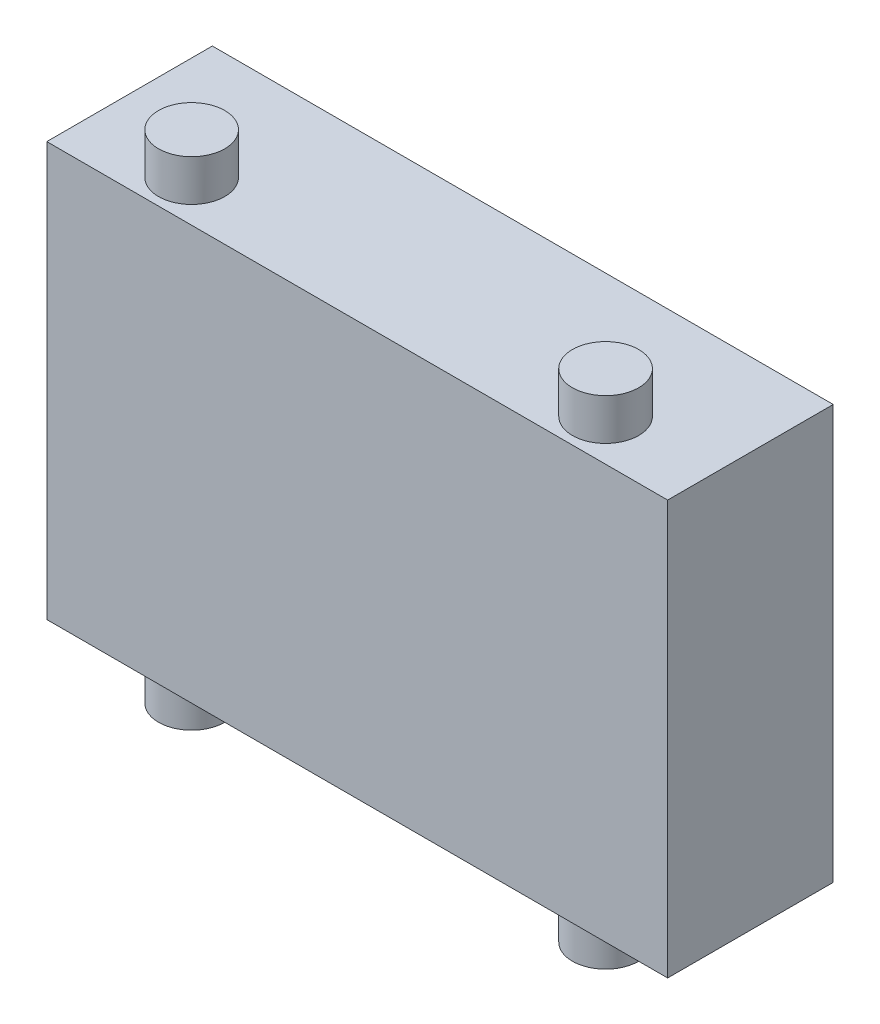
ISO-10303-21;
HEADER;
FILE_DESCRIPTION(('STEP AP214'),'2;1');
FILE_NAME('part.step','',(''),(''),'','','');
FILE_SCHEMA(('AUTOMOTIVE_DESIGN { 1 0 10303 214 1 1 1 1 }'));
ENDSEC;
DATA;
#1=APPLICATION_CONTEXT('core data for automotive mechanical design processes');
#2=APPLICATION_PROTOCOL_DEFINITION('international standard','automotive_design',2000,#1);
#3=PRODUCT_CONTEXT('',#1,'mechanical');
#4=PRODUCT('Part','Part','',(#3));
#5=PRODUCT_RELATED_PRODUCT_CATEGORY('part','',(#4));
#6=PRODUCT_DEFINITION_FORMATION('','',#4);
#7=PRODUCT_DEFINITION_CONTEXT('part definition',#1,'design');
#8=PRODUCT_DEFINITION('design','',#6,#7);
#9=PRODUCT_DEFINITION_SHAPE('','',#8);
#10=(LENGTH_UNIT() NAMED_UNIT(*) SI_UNIT(.MILLI.,.METRE.));
#11=(NAMED_UNIT(*) PLANE_ANGLE_UNIT() SI_UNIT($,.RADIAN.));
#12=(NAMED_UNIT(*) SI_UNIT($,.STERADIAN.) SOLID_ANGLE_UNIT());
#13=UNCERTAINTY_MEASURE_WITH_UNIT(LENGTH_MEASURE(1.E-05),#10,'distance_accuracy_value','');
#14=(GEOMETRIC_REPRESENTATION_CONTEXT(3) GLOBAL_UNCERTAINTY_ASSIGNED_CONTEXT((#13)) GLOBAL_UNIT_ASSIGNED_CONTEXT((#10,
#11,#12)) REPRESENTATION_CONTEXT('',''));
#15=CARTESIAN_POINT('',(0.,0.,0.));
#16=DIRECTION('',(0.,0.,1.));
#17=DIRECTION('',(1.,0.,0.));
#18=AXIS2_PLACEMENT_3D('',#15,#16,#17);
#19=CARTESIAN_POINT('',(150.,-100.,80.));
#20=DIRECTION('',(-1.,0.,0.));
#21=DIRECTION('',(0.,0.,1.));
#22=AXIS2_PLACEMENT_3D('',#19,#20,#21);
#23=PLANE('',#22);
#24=DIRECTION('',(0.,1.,0.));
#25=VECTOR('',#24,1.);
#26=CARTESIAN_POINT('',(150.,-100.,0.));
#27=LINE('',#26,#25);
#28=CARTESIAN_POINT('',(150.,-100.,0.));
#29=VERTEX_POINT('',#28);
#30=CARTESIAN_POINT('',(150.,100.,0.));
#31=VERTEX_POINT('',#30);
#32=EDGE_CURVE('E111',#29,#31,#27,.T.);
#33=ORIENTED_EDGE('',*,*,#32,.T.);
#34=DIRECTION('',(0.,0.,-1.));
#35=VECTOR('',#34,1.);
#36=CARTESIAN_POINT('',(150.,100.,80.));
#37=LINE('',#36,#35);
#38=CARTESIAN_POINT('',(150.,100.,80.));
#39=VERTEX_POINT('',#38);
#40=EDGE_CURVE('E100',#39,#31,#37,.T.);
#41=ORIENTED_EDGE('',*,*,#40,.F.);
#42=DIRECTION('',(0.,1.,0.));
#43=VECTOR('',#42,1.);
#44=CARTESIAN_POINT('',(150.,-100.,80.));
#45=LINE('',#44,#43);
#46=CARTESIAN_POINT('',(150.,-100.,80.));
#47=VERTEX_POINT('',#46);
#48=EDGE_CURVE('E92',#47,#39,#45,.T.);
#49=ORIENTED_EDGE('',*,*,#48,.F.);
#50=DIRECTION('',(0.,0.,-1.));
#51=VECTOR('',#50,1.);
#52=CARTESIAN_POINT('',(150.,-100.,80.));
#53=LINE('',#52,#51);
#54=EDGE_CURVE('E107',#47,#29,#53,.T.);
#55=ORIENTED_EDGE('',*,*,#54,.T.);
#56=EDGE_LOOP('',(#33,#41,#49,#55));
#57=FACE_BOUND('',#56,.T.);
#58=ADVANCED_FACE('F39',(#57),#23,.F.);
#59=CARTESIAN_POINT('',(-150.,100.,80.));
#60=DIRECTION('',(0.,-1.,0.));
#61=DIRECTION('',(0.,0.,-1.));
#62=AXIS2_PLACEMENT_3D('',#59,#60,#61);
#63=PLANE('',#62);
#64=CARTESIAN_POINT('',(99.9999999999999,100.,60.));
#65=DIRECTION('',(0.,-1.,0.));
#66=DIRECTION('',(0.,0.,-1.));
#67=AXIS2_PLACEMENT_3D('',#64,#65,#66);
#68=CIRCLE('',#67,16.0114967020006);
#69=CARTESIAN_POINT('',(99.9999999999999,100.,43.9885032979995));
#70=VERTEX_POINT('',#69);
#71=EDGE_CURVE('E11',#70,#70,#68,.F.);
#72=ORIENTED_EDGE('',*,*,#71,.F.);
#73=EDGE_LOOP('',(#72));
#74=FACE_BOUND('',#73,.T.);
#75=CARTESIAN_POINT('',(-100.,100.,60.));
#76=DIRECTION('',(0.,-1.,0.));
#77=DIRECTION('',(0.,0.,-1.));
#78=AXIS2_PLACEMENT_3D('',#75,#76,#77);
#79=CIRCLE('',#78,16.0114967020006);
#80=CARTESIAN_POINT('',(-100.,100.,43.9885032979995));
#81=VERTEX_POINT('',#80);
#82=EDGE_CURVE('E48',#81,#81,#79,.F.);
#83=ORIENTED_EDGE('',*,*,#82,.F.);
#84=EDGE_LOOP('',(#83));
#85=FACE_BOUND('',#84,.T.);
#86=DIRECTION('',(-1.,0.,0.));
#87=VECTOR('',#86,1.);
#88=CARTESIAN_POINT('',(-150.,100.,0.));
#89=LINE('',#88,#87);
#90=CARTESIAN_POINT('',(-150.,100.,0.));
#91=VERTEX_POINT('',#90);
#92=EDGE_CURVE('E98',#31,#91,#89,.T.);
#93=ORIENTED_EDGE('',*,*,#92,.T.);
#94=DIRECTION('',(0.,0.,-1.));
#95=VECTOR('',#94,1.);
#96=CARTESIAN_POINT('',(-150.,100.,80.));
#97=LINE('',#96,#95);
#98=CARTESIAN_POINT('',(-150.,100.,80.));
#99=VERTEX_POINT('',#98);
#100=EDGE_CURVE('E96',#99,#91,#97,.T.);
#101=ORIENTED_EDGE('',*,*,#100,.F.);
#102=DIRECTION('',(-1.,0.,0.));
#103=VECTOR('',#102,1.);
#104=CARTESIAN_POINT('',(-150.,100.,80.));
#105=LINE('',#104,#103);
#106=EDGE_CURVE('E87',#39,#99,#105,.T.);
#107=ORIENTED_EDGE('',*,*,#106,.F.);
#108=ORIENTED_EDGE('',*,*,#40,.T.);
#109=EDGE_LOOP('',(#93,#101,#107,#108));
#110=FACE_BOUND('',#109,.T.);
#111=ADVANCED_FACE('F97',(#74,#85,#110),#63,.F.);
#112=CARTESIAN_POINT('',(-150.,-100.,80.));
#113=DIRECTION('',(1.,0.,0.));
#114=DIRECTION('',(0.,0.,-1.));
#115=AXIS2_PLACEMENT_3D('',#112,#113,#114);
#116=PLANE('',#115);
#117=DIRECTION('',(0.,-1.,0.));
#118=VECTOR('',#117,1.);
#119=CARTESIAN_POINT('',(-150.,-100.,0.));
#120=LINE('',#119,#118);
#121=CARTESIAN_POINT('',(-150.,-100.,0.));
#122=VERTEX_POINT('',#121);
#123=EDGE_CURVE('E73',#91,#122,#120,.T.);
#124=ORIENTED_EDGE('',*,*,#123,.T.);
#125=DIRECTION('',(0.,0.,-1.));
#126=VECTOR('',#125,1.);
#127=CARTESIAN_POINT('',(-150.,-100.,80.));
#128=LINE('',#127,#126);
#129=CARTESIAN_POINT('',(-150.,-100.,80.));
#130=VERTEX_POINT('',#129);
#131=EDGE_CURVE('E101',#130,#122,#128,.T.);
#132=ORIENTED_EDGE('',*,*,#131,.F.);
#133=DIRECTION('',(0.,-1.,0.));
#134=VECTOR('',#133,1.);
#135=CARTESIAN_POINT('',(-150.,-100.,80.));
#136=LINE('',#135,#134);
#137=EDGE_CURVE('E90',#99,#130,#136,.T.);
#138=ORIENTED_EDGE('',*,*,#137,.F.);
#139=ORIENTED_EDGE('',*,*,#100,.T.);
#140=EDGE_LOOP('',(#124,#132,#138,#139));
#141=FACE_BOUND('',#140,.T.);
#142=ADVANCED_FACE('F103',(#141),#116,.F.);
#143=CARTESIAN_POINT('',(-150.,-100.,80.));
#144=DIRECTION('',(0.,1.,0.));
#145=DIRECTION('',(0.,0.,1.));
#146=AXIS2_PLACEMENT_3D('',#143,#144,#145);
#147=PLANE('',#146);
#148=CARTESIAN_POINT('',(99.9999999999999,-100.,60.));
#149=DIRECTION('',(0.,1.,0.));
#150=DIRECTION('',(0.,0.,-1.));
#151=AXIS2_PLACEMENT_3D('',#148,#149,#150);
#152=CIRCLE('',#151,16.0114967020006);
#153=CARTESIAN_POINT('',(99.9999999999999,-100.,43.9885032979995));
#154=VERTEX_POINT('',#153);
#155=EDGE_CURVE('E197',#154,#154,#152,.T.);
#156=ORIENTED_EDGE('',*,*,#155,.T.);
#157=EDGE_LOOP('',(#156));
#158=FACE_BOUND('',#157,.T.);
#159=CARTESIAN_POINT('',(-100.,-100.,60.));
#160=DIRECTION('',(0.,1.,0.));
#161=DIRECTION('',(0.,0.,1.));
#162=AXIS2_PLACEMENT_3D('',#159,#160,#161);
#163=CIRCLE('',#162,16.0114967020006);
#164=CARTESIAN_POINT('',(-100.,-100.,76.0114967020006));
#165=VERTEX_POINT('',#164);
#166=EDGE_CURVE('E210',#165,#165,#163,.T.);
#167=ORIENTED_EDGE('',*,*,#166,.T.);
#168=EDGE_LOOP('',(#167));
#169=FACE_BOUND('',#168,.T.);
#170=DIRECTION('',(1.,0.,0.));
#171=VECTOR('',#170,1.);
#172=CARTESIAN_POINT('',(-150.,-100.,0.));
#173=LINE('',#172,#171);
#174=EDGE_CURVE('E79',#122,#29,#173,.T.);
#175=ORIENTED_EDGE('',*,*,#174,.T.);
#176=ORIENTED_EDGE('',*,*,#54,.F.);
#177=DIRECTION('',(1.,0.,0.));
#178=VECTOR('',#177,1.);
#179=CARTESIAN_POINT('',(-150.,-100.,80.));
#180=LINE('',#179,#178);
#181=EDGE_CURVE('E56',#130,#47,#180,.T.);
#182=ORIENTED_EDGE('',*,*,#181,.F.);
#183=ORIENTED_EDGE('',*,*,#131,.T.);
#184=EDGE_LOOP('',(#175,#176,#182,#183));
#185=FACE_BOUND('',#184,.T.);
#186=ADVANCED_FACE('F139',(#158,#169,#185),#147,.F.);
#187=CARTESIAN_POINT('',(0.,0.,80.));
#188=DIRECTION('',(0.,0.,-1.));
#189=DIRECTION('',(-1.,0.,0.));
#190=AXIS2_PLACEMENT_3D('',#187,#188,#189);
#191=PLANE('',#190);
#192=ORIENTED_EDGE('',*,*,#48,.T.);
#193=ORIENTED_EDGE('',*,*,#106,.T.);
#194=ORIENTED_EDGE('',*,*,#137,.T.);
#195=ORIENTED_EDGE('',*,*,#181,.T.);
#196=EDGE_LOOP('',(#192,#193,#194,#195));
#197=FACE_BOUND('',#196,.T.);
#198=ADVANCED_FACE('F88',(#197),#191,.F.);
#199=CARTESIAN_POINT('',(0.,0.,0.));
#200=DIRECTION('',(0.,0.,-1.));
#201=DIRECTION('',(-1.,0.,0.));
#202=AXIS2_PLACEMENT_3D('',#199,#200,#201);
#203=PLANE('',#202);
#204=CARTESIAN_POINT('',(-84.110111850432,0.,0.));
#205=DIRECTION('',(0.,0.,-1.));
#206=DIRECTION('',(-1.,0.,0.));
#207=AXIS2_PLACEMENT_3D('',#204,#205,#206);
#208=CIRCLE('',#207,19.343729762712);
#209=CARTESIAN_POINT('',(-103.453841613144,0.,0.));
#210=VERTEX_POINT('',#209);
#211=EDGE_CURVE('E198',#210,#210,#208,.T.);
#212=ORIENTED_EDGE('',*,*,#211,.F.);
#213=EDGE_LOOP('',(#212));
#214=FACE_BOUND('',#213,.T.);
#215=ORIENTED_EDGE('',*,*,#32,.F.);
#216=ORIENTED_EDGE('',*,*,#174,.F.);
#217=ORIENTED_EDGE('',*,*,#123,.F.);
#218=ORIENTED_EDGE('',*,*,#92,.F.);
#219=EDGE_LOOP('',(#215,#216,#217,#218));
#220=FACE_BOUND('',#219,.T.);
#221=ADVANCED_FACE('F147',(#214,#220),#203,.T.);
#222=CARTESIAN_POINT('',(-100.,120.,60.));
#223=DIRECTION('',(0.,-1.,0.));
#224=DIRECTION('',(0.,0.,-1.));
#225=AXIS2_PLACEMENT_3D('',#222,#223,#224);
#226=CYLINDRICAL_SURFACE('',#225,16.0114967020006);
#227=CARTESIAN_POINT('',(-100.,120.,60.));
#228=DIRECTION('',(0.,1.,0.));
#229=DIRECTION('',(0.,0.,1.));
#230=AXIS2_PLACEMENT_3D('',#227,#228,#229);
#231=CIRCLE('',#230,16.0114967020006);
#232=CARTESIAN_POINT('',(-100.,120.,76.0114967020006));
#233=VERTEX_POINT('',#232);
#234=EDGE_CURVE('E115',#233,#233,#231,.T.);
#235=ORIENTED_EDGE('',*,*,#234,.F.);
#236=EDGE_LOOP('',(#235));
#237=FACE_BOUND('',#236,.T.);
#238=ORIENTED_EDGE('',*,*,#82,.T.);
#239=EDGE_LOOP('',(#238));
#240=FACE_BOUND('',#239,.T.);
#241=ADVANCED_FACE('F131',(#237,#240),#226,.T.);
#242=CARTESIAN_POINT('',(-100.,120.,60.));
#243=DIRECTION('',(0.,1.,0.));
#244=DIRECTION('',(0.,0.,1.));
#245=AXIS2_PLACEMENT_3D('',#242,#243,#244);
#246=PLANE('',#245);
#247=ORIENTED_EDGE('',*,*,#234,.T.);
#248=EDGE_LOOP('',(#247));
#249=FACE_BOUND('',#248,.T.);
#250=ADVANCED_FACE('F155',(#249),#246,.T.);
#251=CARTESIAN_POINT('',(99.9999999999999,120.,60.));
#252=DIRECTION('',(0.,-1.,0.));
#253=DIRECTION('',(0.,0.,-1.));
#254=AXIS2_PLACEMENT_3D('',#251,#252,#253);
#255=CYLINDRICAL_SURFACE('',#254,16.0114967020006);
#256=CARTESIAN_POINT('',(99.9999999999999,120.,60.));
#257=DIRECTION('',(0.,1.,0.));
#258=DIRECTION('',(0.,0.,-1.));
#259=AXIS2_PLACEMENT_3D('',#256,#257,#258);
#260=CIRCLE('',#259,16.0114967020006);
#261=CARTESIAN_POINT('',(99.9999999999999,120.,43.9885032979995));
#262=VERTEX_POINT('',#261);
#263=EDGE_CURVE('E216',#262,#262,#260,.T.);
#264=ORIENTED_EDGE('',*,*,#263,.F.);
#265=EDGE_LOOP('',(#264));
#266=FACE_BOUND('',#265,.T.);
#267=ORIENTED_EDGE('',*,*,#71,.T.);
#268=EDGE_LOOP('',(#267));
#269=FACE_BOUND('',#268,.T.);
#270=ADVANCED_FACE('F159',(#266,#269),#255,.T.);
#271=CARTESIAN_POINT('',(99.9999999999999,120.,60.));
#272=DIRECTION('',(0.,-1.,0.));
#273=DIRECTION('',(0.,0.,-1.));
#274=AXIS2_PLACEMENT_3D('',#271,#272,#273);
#275=PLANE('',#274);
#276=ORIENTED_EDGE('',*,*,#263,.T.);
#277=EDGE_LOOP('',(#276));
#278=FACE_BOUND('',#277,.T.);
#279=ADVANCED_FACE('F163',(#278),#275,.F.);
#280=CARTESIAN_POINT('',(-100.,-120.,60.));
#281=DIRECTION('',(0.,1.,0.));
#282=DIRECTION('',(0.,0.,1.));
#283=AXIS2_PLACEMENT_3D('',#280,#281,#282);
#284=CYLINDRICAL_SURFACE('',#283,16.0114967020006);
#285=CARTESIAN_POINT('',(-100.,-120.,60.));
#286=DIRECTION('',(0.,1.,0.));
#287=DIRECTION('',(0.,0.,1.));
#288=AXIS2_PLACEMENT_3D('',#285,#286,#287);
#289=CIRCLE('',#288,16.0114967020006);
#290=CARTESIAN_POINT('',(-100.,-120.,76.0114967020006));
#291=VERTEX_POINT('',#290);
#292=EDGE_CURVE('E212',#291,#291,#289,.T.);
#293=ORIENTED_EDGE('',*,*,#292,.T.);
#294=EDGE_LOOP('',(#293));
#295=FACE_BOUND('',#294,.T.);
#296=ORIENTED_EDGE('',*,*,#166,.F.);
#297=EDGE_LOOP('',(#296));
#298=FACE_BOUND('',#297,.T.);
#299=ADVANCED_FACE('F167',(#295,#298),#284,.T.);
#300=CARTESIAN_POINT('',(-100.,-120.,60.));
#301=DIRECTION('',(0.,-1.,0.));
#302=DIRECTION('',(0.,0.,1.));
#303=AXIS2_PLACEMENT_3D('',#300,#301,#302);
#304=PLANE('',#303);
#305=ORIENTED_EDGE('',*,*,#292,.F.);
#306=EDGE_LOOP('',(#305));
#307=FACE_BOUND('',#306,.T.);
#308=ADVANCED_FACE('F171',(#307),#304,.T.);
#309=CARTESIAN_POINT('',(99.9999999999999,-120.,60.));
#310=DIRECTION('',(0.,1.,0.));
#311=DIRECTION('',(0.,0.,1.));
#312=AXIS2_PLACEMENT_3D('',#309,#310,#311);
#313=CYLINDRICAL_SURFACE('',#312,16.0114967020006);
#314=CARTESIAN_POINT('',(99.9999999999999,-120.,60.));
#315=DIRECTION('',(0.,1.,0.));
#316=DIRECTION('',(0.,0.,-1.));
#317=AXIS2_PLACEMENT_3D('',#314,#315,#316);
#318=CIRCLE('',#317,16.0114967020006);
#319=CARTESIAN_POINT('',(99.9999999999999,-120.,43.9885032979995));
#320=VERTEX_POINT('',#319);
#321=EDGE_CURVE('E203',#320,#320,#318,.T.);
#322=ORIENTED_EDGE('',*,*,#321,.T.);
#323=EDGE_LOOP('',(#322));
#324=FACE_BOUND('',#323,.T.);
#325=ORIENTED_EDGE('',*,*,#155,.F.);
#326=EDGE_LOOP('',(#325));
#327=FACE_BOUND('',#326,.T.);
#328=ADVANCED_FACE('F175',(#324,#327),#313,.T.);
#329=CARTESIAN_POINT('',(99.9999999999999,-120.,60.));
#330=DIRECTION('',(0.,1.,0.));
#331=DIRECTION('',(0.,0.,-1.));
#332=AXIS2_PLACEMENT_3D('',#329,#330,#331);
#333=PLANE('',#332);
#334=ORIENTED_EDGE('',*,*,#321,.F.);
#335=EDGE_LOOP('',(#334));
#336=FACE_BOUND('',#335,.T.);
#337=ADVANCED_FACE('F179',(#336),#333,.F.);
#338=CARTESIAN_POINT('',(-84.110111850432,0.,-20.));
#339=DIRECTION('',(0.,0.,1.));
#340=DIRECTION('',(1.,0.,0.));
#341=AXIS2_PLACEMENT_3D('',#338,#339,#340);
#342=CYLINDRICAL_SURFACE('',#341,19.343729762712);
#343=CARTESIAN_POINT('',(-84.110111850432,0.,-20.));
#344=DIRECTION('',(0.,0.,-1.));
#345=DIRECTION('',(-1.,0.,0.));
#346=AXIS2_PLACEMENT_3D('',#343,#344,#345);
#347=CIRCLE('',#346,19.343729762712);
#348=CARTESIAN_POINT('',(-103.453841613144,0.,-20.));
#349=VERTEX_POINT('',#348);
#350=EDGE_CURVE('E195',#349,#349,#347,.T.);
#351=ORIENTED_EDGE('',*,*,#350,.F.);
#352=EDGE_LOOP('',(#351));
#353=FACE_BOUND('',#352,.T.);
#354=ORIENTED_EDGE('',*,*,#211,.T.);
#355=EDGE_LOOP('',(#354));
#356=FACE_BOUND('',#355,.T.);
#357=ADVANCED_FACE('F183',(#353,#356),#342,.T.);
#358=CARTESIAN_POINT('',(-84.110111850432,0.,-20.));
#359=DIRECTION('',(0.,0.,-1.));
#360=DIRECTION('',(-1.,0.,0.));
#361=AXIS2_PLACEMENT_3D('',#358,#359,#360);
#362=PLANE('',#361);
#363=ORIENTED_EDGE('',*,*,#350,.T.);
#364=EDGE_LOOP('',(#363));
#365=FACE_BOUND('',#364,.T.);
#366=ADVANCED_FACE('F187',(#365),#362,.T.);
#367=CLOSED_SHELL('',(#58,#111,#142,#186,#198,#221,#241,#250,#270,#279,#299,#308,#328,#337,#357,#366));
#368=MANIFOLD_SOLID_BREP('B2',#367);
#369=ADVANCED_BREP_SHAPE_REPRESENTATION('',(#18,#368),#14);
#370=SHAPE_DEFINITION_REPRESENTATION(#9,#369);
ENDSEC;
END-ISO-10303-21;
